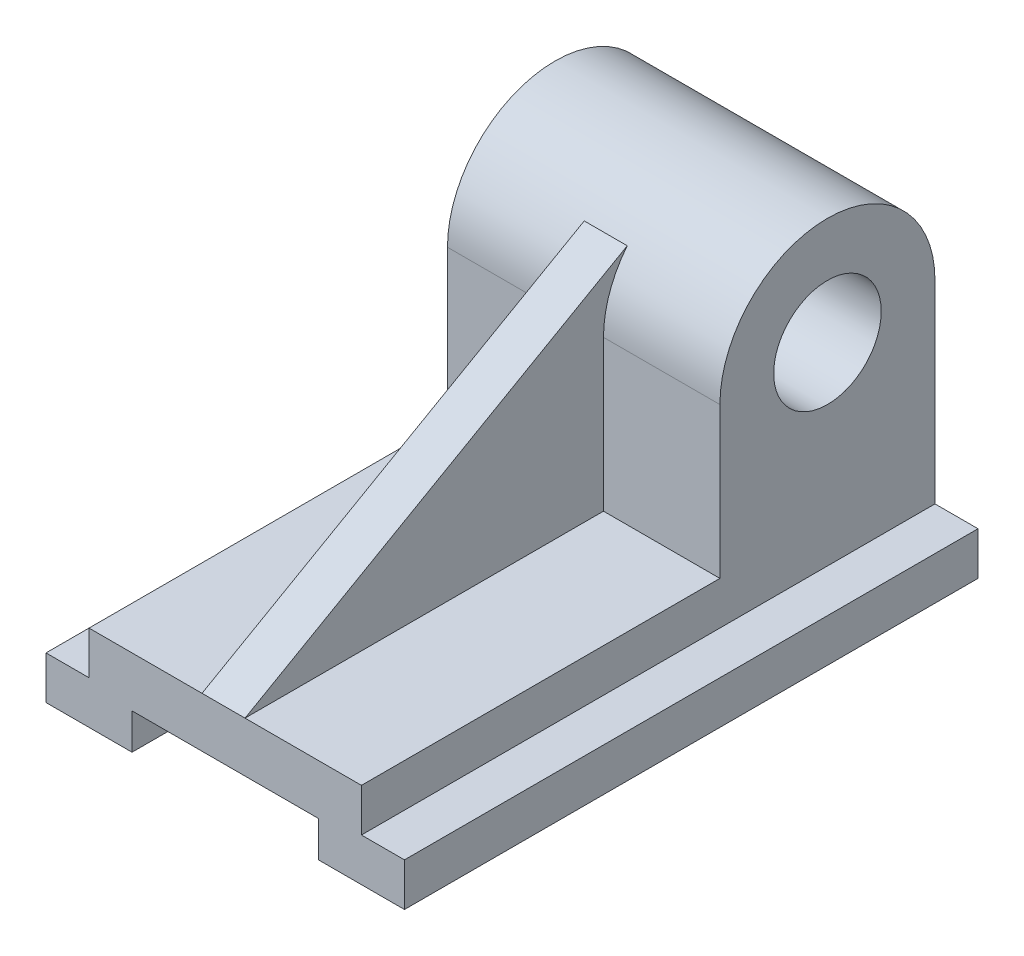
ISO-10303-21;
HEADER;
FILE_DESCRIPTION(('STEP AP214'),'2;1');
FILE_NAME('part.step','',(''),(''),'','','');
FILE_SCHEMA(('AUTOMOTIVE_DESIGN { 1 0 10303 214 1 1 1 1 }'));
ENDSEC;
DATA;
#1=APPLICATION_CONTEXT('core data for automotive mechanical design processes');
#2=APPLICATION_PROTOCOL_DEFINITION('international standard','automotive_design',2000,#1);
#3=PRODUCT_CONTEXT('',#1,'mechanical');
#4=PRODUCT('Part','Part','',(#3));
#5=PRODUCT_RELATED_PRODUCT_CATEGORY('part','',(#4));
#6=PRODUCT_DEFINITION_FORMATION('','',#4);
#7=PRODUCT_DEFINITION_CONTEXT('part definition',#1,'design');
#8=PRODUCT_DEFINITION('design','',#6,#7);
#9=PRODUCT_DEFINITION_SHAPE('','',#8);
#10=(LENGTH_UNIT() NAMED_UNIT(*) SI_UNIT(.MILLI.,.METRE.));
#11=(NAMED_UNIT(*) PLANE_ANGLE_UNIT() SI_UNIT($,.RADIAN.));
#12=(NAMED_UNIT(*) SI_UNIT($,.STERADIAN.) SOLID_ANGLE_UNIT());
#13=UNCERTAINTY_MEASURE_WITH_UNIT(LENGTH_MEASURE(1.E-05),#10,'distance_accuracy_value','');
#14=(GEOMETRIC_REPRESENTATION_CONTEXT(3) GLOBAL_UNCERTAINTY_ASSIGNED_CONTEXT((#13)) GLOBAL_UNIT_ASSIGNED_CONTEXT((#10,
#11,#12)) REPRESENTATION_CONTEXT('',''));
#15=CARTESIAN_POINT('',(0.,0.,0.));
#16=DIRECTION('',(0.,0.,1.));
#17=DIRECTION('',(1.,0.,0.));
#18=AXIS2_PLACEMENT_3D('',#15,#16,#17);
#19=CARTESIAN_POINT('',(0.,24.,-160.));
#20=DIRECTION('',(0.,-1.,0.));
#21=DIRECTION('',(0.,0.,-1.));
#22=AXIS2_PLACEMENT_3D('',#19,#20,#21);
#23=PLANE('',#22);
#24=DIRECTION('',(0.,0.,-1.));
#25=VECTOR('',#24,1.);
#26=CARTESIAN_POINT('',(0.,24.,-109.656121138035));
#27=LINE('',#26,#25);
#28=CARTESIAN_POINT('',(0.,24.,0.));
#29=VERTEX_POINT('',#28);
#30=CARTESIAN_POINT('',(0.,24.,-100.));
#31=VERTEX_POINT('',#30);
#32=EDGE_CURVE('E350',#29,#31,#27,.T.);
#33=ORIENTED_EDGE('',*,*,#32,.T.);
#34=DIRECTION('',(1.,0.,0.));
#35=VECTOR('',#34,1.);
#36=CARTESIAN_POINT('',(-31.5215946843854,24.,-100.));
#37=LINE('',#36,#35);
#38=CARTESIAN_POINT('',(-31.5215946843854,24.,-100.));
#39=VERTEX_POINT('',#38);
#40=EDGE_CURVE('E62',#39,#31,#37,.T.);
#41=ORIENTED_EDGE('',*,*,#40,.F.);
#42=DIRECTION('',(0.,0.,1.));
#43=VECTOR('',#42,1.);
#44=CARTESIAN_POINT('',(-31.5215946843854,24.,-160.));
#45=LINE('',#44,#43);
#46=CARTESIAN_POINT('',(-31.5215946843854,24.,0.));
#47=VERTEX_POINT('',#46);
#48=EDGE_CURVE('E227',#39,#47,#45,.T.);
#49=ORIENTED_EDGE('',*,*,#48,.T.);
#50=DIRECTION('',(1.,0.,0.));
#51=VECTOR('',#50,1.);
#52=CARTESIAN_POINT('',(0.,24.,0.));
#53=LINE('',#52,#51);
#54=EDGE_CURVE('E195',#47,#29,#53,.T.);
#55=ORIENTED_EDGE('',*,*,#54,.T.);
#56=EDGE_LOOP('',(#33,#41,#49,#55));
#57=FACE_BOUND('',#56,.T.);
#58=ADVANCED_FACE('F39',(#57),#23,.F.);
#59=CARTESIAN_POINT('',(-31.5215946843854,0.,-100.));
#60=DIRECTION('',(0.,0.,1.));
#61=DIRECTION('',(1.,0.,0.));
#62=AXIS2_PLACEMENT_3D('',#59,#60,#61);
#63=PLANE('',#62);
#64=ORIENTED_EDGE('',*,*,#40,.T.);
#65=DIRECTION('',(0.,1.,0.));
#66=VECTOR('',#65,1.);
#67=CARTESIAN_POINT('',(0.,0.,-100.));
#68=LINE('',#67,#66);
#69=CARTESIAN_POINT('',(0.,66.,-100.));
#70=VERTEX_POINT('',#69);
#71=EDGE_CURVE('E180',#31,#70,#68,.T.);
#72=ORIENTED_EDGE('',*,*,#71,.T.);
#73=DIRECTION('',(1.,0.,0.));
#74=VECTOR('',#73,1.);
#75=CARTESIAN_POINT('',(-31.5215946843854,66.,-100.));
#76=LINE('',#75,#74);
#77=CARTESIAN_POINT('',(-31.5215946843854,66.,-100.));
#78=VERTEX_POINT('',#77);
#79=EDGE_CURVE('E251',#78,#70,#76,.T.);
#80=ORIENTED_EDGE('',*,*,#79,.F.);
#81=DIRECTION('',(0.,-1.,0.));
#82=VECTOR('',#81,1.);
#83=CARTESIAN_POINT('',(-31.5215946843854,0.,-100.));
#84=LINE('',#83,#82);
#85=EDGE_CURVE('E270',#78,#39,#84,.T.);
#86=ORIENTED_EDGE('',*,*,#85,.T.);
#87=EDGE_LOOP('',(#64,#72,#80,#86));
#88=FACE_BOUND('',#87,.T.);
#89=ADVANCED_FACE('F255',(#88),#63,.T.);
#90=CARTESIAN_POINT('',(12.,24.,-100.));
#91=VERTEX_POINT('',#90);
#92=CARTESIAN_POINT('',(44.4784053156146,24.,-100.));
#93=VERTEX_POINT('',#92);
#94=EDGE_CURVE('E188',#91,#93,#37,.T.);
#95=ORIENTED_EDGE('',*,*,#94,.F.);
#96=DIRECTION('',(0.,0.,-1.));
#97=VECTOR('',#96,1.);
#98=CARTESIAN_POINT('',(12.,24.,-109.656121138035));
#99=LINE('',#98,#97);
#100=CARTESIAN_POINT('',(12.,24.,0.));
#101=VERTEX_POINT('',#100);
#102=EDGE_CURVE('E167',#101,#91,#99,.T.);
#103=ORIENTED_EDGE('',*,*,#102,.F.);
#104=CARTESIAN_POINT('',(44.4784053156146,24.,0.));
#105=VERTEX_POINT('',#104);
#106=EDGE_CURVE('E186',#101,#105,#53,.T.);
#107=ORIENTED_EDGE('',*,*,#106,.T.);
#108=DIRECTION('',(0.,0.,1.));
#109=VECTOR('',#108,1.);
#110=CARTESIAN_POINT('',(44.4784053156146,24.,-160.));
#111=LINE('',#110,#109);
#112=EDGE_CURVE('E229',#93,#105,#111,.T.);
#113=ORIENTED_EDGE('',*,*,#112,.F.);
#114=EDGE_LOOP('',(#95,#103,#107,#113));
#115=FACE_BOUND('',#114,.T.);
#116=ADVANCED_FACE('F184',(#115),#23,.F.);
#117=CARTESIAN_POINT('',(0.,10.,-160.));
#118=DIRECTION('',(0.,-1.,0.));
#119=DIRECTION('',(0.,0.,-1.));
#120=AXIS2_PLACEMENT_3D('',#117,#118,#119);
#121=PLANE('',#120);
#122=DIRECTION('',(1.,0.,0.));
#123=VECTOR('',#122,1.);
#124=CARTESIAN_POINT('',(0.,10.,0.));
#125=LINE('',#124,#123);
#126=CARTESIAN_POINT('',(-19.5215946843854,10.,0.));
#127=VERTEX_POINT('',#126);
#128=CARTESIAN_POINT('',(32.4784053156146,10.,0.));
#129=VERTEX_POINT('',#128);
#130=EDGE_CURVE('E281',#127,#129,#125,.T.);
#131=ORIENTED_EDGE('',*,*,#130,.F.);
#132=DIRECTION('',(0.,0.,1.));
#133=VECTOR('',#132,1.);
#134=CARTESIAN_POINT('',(-19.5215946843854,10.,-160.));
#135=LINE('',#134,#133);
#136=CARTESIAN_POINT('',(-19.5215946843854,10.,-160.));
#137=VERTEX_POINT('',#136);
#138=EDGE_CURVE('E213',#137,#127,#135,.T.);
#139=ORIENTED_EDGE('',*,*,#138,.F.);
#140=DIRECTION('',(1.,0.,0.));
#141=VECTOR('',#140,1.);
#142=CARTESIAN_POINT('',(0.,10.,-160.));
#143=LINE('',#142,#141);
#144=CARTESIAN_POINT('',(32.4784053156146,10.,-160.));
#145=VERTEX_POINT('',#144);
#146=EDGE_CURVE('E212',#137,#145,#143,.T.);
#147=ORIENTED_EDGE('',*,*,#146,.T.);
#148=DIRECTION('',(0.,0.,1.));
#149=VECTOR('',#148,1.);
#150=CARTESIAN_POINT('',(32.4784053156146,10.,-160.));
#151=LINE('',#150,#149);
#152=EDGE_CURVE('E242',#145,#129,#151,.T.);
#153=ORIENTED_EDGE('',*,*,#152,.T.);
#154=EDGE_LOOP('',(#131,#139,#147,#153));
#155=FACE_BOUND('',#154,.T.);
#156=ADVANCED_FACE('F41',(#155),#121,.T.);
#157=CARTESIAN_POINT('',(-19.5215946843854,0.,-160.));
#158=DIRECTION('',(1.,0.,0.));
#159=DIRECTION('',(0.,0.,-1.));
#160=AXIS2_PLACEMENT_3D('',#157,#158,#159);
#161=PLANE('',#160);
#162=DIRECTION('',(0.,1.,0.));
#163=VECTOR('',#162,1.);
#164=CARTESIAN_POINT('',(-19.5215946843854,0.,0.));
#165=LINE('',#164,#163);
#166=CARTESIAN_POINT('',(-19.5215946843854,0.,0.));
#167=VERTEX_POINT('',#166);
#168=EDGE_CURVE('E209',#167,#127,#165,.T.);
#169=ORIENTED_EDGE('',*,*,#168,.F.);
#170=DIRECTION('',(0.,0.,1.));
#171=VECTOR('',#170,1.);
#172=CARTESIAN_POINT('',(-19.5215946843854,0.,-160.));
#173=LINE('',#172,#171);
#174=CARTESIAN_POINT('',(-19.5215946843854,0.,-160.));
#175=VERTEX_POINT('',#174);
#176=EDGE_CURVE('E216',#175,#167,#173,.T.);
#177=ORIENTED_EDGE('',*,*,#176,.F.);
#178=DIRECTION('',(0.,1.,0.));
#179=VECTOR('',#178,1.);
#180=CARTESIAN_POINT('',(-19.5215946843854,0.,-160.));
#181=LINE('',#180,#179);
#182=EDGE_CURVE('E244',#175,#137,#181,.T.);
#183=ORIENTED_EDGE('',*,*,#182,.T.);
#184=ORIENTED_EDGE('',*,*,#138,.T.);
#185=EDGE_LOOP('',(#169,#177,#183,#184));
#186=FACE_BOUND('',#185,.T.);
#187=ADVANCED_FACE('F369',(#186),#161,.T.);
#188=CARTESIAN_POINT('',(0.,0.,-160.));
#189=DIRECTION('',(0.,1.,0.));
#190=DIRECTION('',(-1.,0.,0.));
#191=AXIS2_PLACEMENT_3D('',#188,#189,#190);
#192=PLANE('',#191);
#193=DIRECTION('',(-1.,0.,0.));
#194=VECTOR('',#193,1.);
#195=CARTESIAN_POINT('',(0.,0.,0.));
#196=LINE('',#195,#194);
#197=CARTESIAN_POINT('',(-43.5215946843854,0.,0.));
#198=VERTEX_POINT('',#197);
#199=EDGE_CURVE('E208',#167,#198,#196,.T.);
#200=ORIENTED_EDGE('',*,*,#199,.T.);
#201=DIRECTION('',(0.,0.,1.));
#202=VECTOR('',#201,1.);
#203=CARTESIAN_POINT('',(-43.5215946843854,0.,-160.));
#204=LINE('',#203,#202);
#205=CARTESIAN_POINT('',(-43.5215946843854,0.,-160.));
#206=VERTEX_POINT('',#205);
#207=EDGE_CURVE('E218',#206,#198,#204,.T.);
#208=ORIENTED_EDGE('',*,*,#207,.F.);
#209=DIRECTION('',(-1.,0.,0.));
#210=VECTOR('',#209,1.);
#211=CARTESIAN_POINT('',(0.,0.,-160.));
#212=LINE('',#211,#210);
#213=EDGE_CURVE('E294',#175,#206,#212,.T.);
#214=ORIENTED_EDGE('',*,*,#213,.F.);
#215=ORIENTED_EDGE('',*,*,#176,.T.);
#216=EDGE_LOOP('',(#200,#208,#214,#215));
#217=FACE_BOUND('',#216,.T.);
#218=ADVANCED_FACE('F365',(#217),#192,.F.);
#219=CARTESIAN_POINT('',(-43.5215946843854,0.,-160.));
#220=DIRECTION('',(1.,0.,0.));
#221=DIRECTION('',(0.,0.,-1.));
#222=AXIS2_PLACEMENT_3D('',#219,#220,#221);
#223=PLANE('',#222);
#224=DIRECTION('',(0.,1.,0.));
#225=VECTOR('',#224,1.);
#226=CARTESIAN_POINT('',(-43.5215946843854,0.,0.));
#227=LINE('',#226,#225);
#228=CARTESIAN_POINT('',(-43.5215946843854,12.,0.));
#229=VERTEX_POINT('',#228);
#230=EDGE_CURVE('E206',#198,#229,#227,.T.);
#231=ORIENTED_EDGE('',*,*,#230,.T.);
#232=DIRECTION('',(0.,0.,1.));
#233=VECTOR('',#232,1.);
#234=CARTESIAN_POINT('',(-43.5215946843854,12.,-160.));
#235=LINE('',#234,#233);
#236=CARTESIAN_POINT('',(-43.5215946843854,12.,-160.));
#237=VERTEX_POINT('',#236);
#238=EDGE_CURVE('E221',#237,#229,#235,.T.);
#239=ORIENTED_EDGE('',*,*,#238,.F.);
#240=DIRECTION('',(0.,1.,0.));
#241=VECTOR('',#240,1.);
#242=CARTESIAN_POINT('',(-43.5215946843854,0.,-160.));
#243=LINE('',#242,#241);
#244=EDGE_CURVE('E304',#206,#237,#243,.T.);
#245=ORIENTED_EDGE('',*,*,#244,.F.);
#246=ORIENTED_EDGE('',*,*,#207,.T.);
#247=EDGE_LOOP('',(#231,#239,#245,#246));
#248=FACE_BOUND('',#247,.T.);
#249=ADVANCED_FACE('F361',(#248),#223,.F.);
#250=CARTESIAN_POINT('',(0.,12.,-160.));
#251=DIRECTION('',(0.,-1.,0.));
#252=DIRECTION('',(0.,0.,-1.));
#253=AXIS2_PLACEMENT_3D('',#250,#251,#252);
#254=PLANE('',#253);
#255=DIRECTION('',(1.,0.,0.));
#256=VECTOR('',#255,1.);
#257=CARTESIAN_POINT('',(0.,12.,0.));
#258=LINE('',#257,#256);
#259=CARTESIAN_POINT('',(-31.5215946843854,12.,0.));
#260=VERTEX_POINT('',#259);
#261=EDGE_CURVE('E204',#229,#260,#258,.T.);
#262=ORIENTED_EDGE('',*,*,#261,.T.);
#263=DIRECTION('',(0.,0.,1.));
#264=VECTOR('',#263,1.);
#265=CARTESIAN_POINT('',(-31.5215946843854,12.,-160.));
#266=LINE('',#265,#264);
#267=CARTESIAN_POINT('',(-31.5215946843854,12.,-160.));
#268=VERTEX_POINT('',#267);
#269=EDGE_CURVE('E224',#268,#260,#266,.T.);
#270=ORIENTED_EDGE('',*,*,#269,.F.);
#271=DIRECTION('',(1.,0.,0.));
#272=VECTOR('',#271,1.);
#273=CARTESIAN_POINT('',(0.,12.,-160.));
#274=LINE('',#273,#272);
#275=EDGE_CURVE('E302',#237,#268,#274,.T.);
#276=ORIENTED_EDGE('',*,*,#275,.F.);
#277=ORIENTED_EDGE('',*,*,#238,.T.);
#278=EDGE_LOOP('',(#262,#270,#276,#277));
#279=FACE_BOUND('',#278,.T.);
#280=ADVANCED_FACE('F356',(#279),#254,.F.);
#281=CARTESIAN_POINT('',(-31.5215946843854,0.,-160.));
#282=DIRECTION('',(1.,0.,0.));
#283=DIRECTION('',(0.,0.,-1.));
#284=AXIS2_PLACEMENT_3D('',#281,#282,#283);
#285=PLANE('',#284);
#286=DIRECTION('',(0.,1.,0.));
#287=VECTOR('',#286,1.);
#288=CARTESIAN_POINT('',(-31.5215946843854,0.,0.));
#289=LINE('',#288,#287);
#290=EDGE_CURVE('E197',#260,#47,#289,.T.);
#291=ORIENTED_EDGE('',*,*,#290,.T.);
#292=ORIENTED_EDGE('',*,*,#48,.F.);
#293=ORIENTED_EDGE('',*,*,#85,.F.);
#294=CARTESIAN_POINT('',(-31.5215946843854,66.,-130.));
#295=DIRECTION('',(1.,0.,0.));
#296=DIRECTION('',(0.,0.,-1.));
#297=AXIS2_PLACEMENT_3D('',#294,#295,#296);
#298=CIRCLE('',#297,30.);
#299=CARTESIAN_POINT('',(-31.5215946843854,66.,-160.));
#300=VERTEX_POINT('',#299);
#301=EDGE_CURVE('E267',#300,#78,#298,.T.);
#302=ORIENTED_EDGE('',*,*,#301,.F.);
#303=DIRECTION('',(0.,1.,0.));
#304=VECTOR('',#303,1.);
#305=CARTESIAN_POINT('',(-31.5215946843854,0.,-160.));
#306=LINE('',#305,#304);
#307=EDGE_CURVE('E300',#268,#300,#306,.T.);
#308=ORIENTED_EDGE('',*,*,#307,.F.);
#309=ORIENTED_EDGE('',*,*,#269,.T.);
#310=EDGE_LOOP('',(#291,#292,#293,#302,#308,#309));
#311=FACE_BOUND('',#310,.T.);
#312=CARTESIAN_POINT('',(-31.5215946843854,66.,-130.));
#313=DIRECTION('',(1.,0.,0.));
#314=DIRECTION('',(0.,0.,-1.));
#315=AXIS2_PLACEMENT_3D('',#312,#313,#314);
#316=CIRCLE('',#315,15.);
#317=CARTESIAN_POINT('',(-31.5215946843854,66.,-145.));
#318=VERTEX_POINT('',#317);
#319=EDGE_CURVE('E264',#318,#318,#316,.T.);
#320=ORIENTED_EDGE('',*,*,#319,.T.);
#321=EDGE_LOOP('',(#320));
#322=FACE_BOUND('',#321,.T.);
#323=ADVANCED_FACE('F347',(#311,#322),#285,.F.);
#324=CARTESIAN_POINT('',(44.4784053156146,0.,-160.));
#325=DIRECTION('',(-1.,0.,0.));
#326=DIRECTION('',(0.,0.,1.));
#327=AXIS2_PLACEMENT_3D('',#324,#325,#326);
#328=PLANE('',#327);
#329=DIRECTION('',(0.,-1.,0.));
#330=VECTOR('',#329,1.);
#331=CARTESIAN_POINT('',(44.4784053156146,0.,0.));
#332=LINE('',#331,#330);
#333=CARTESIAN_POINT('',(44.4784053156146,12.,0.));
#334=VERTEX_POINT('',#333);
#335=EDGE_CURVE('E194',#105,#334,#332,.T.);
#336=ORIENTED_EDGE('',*,*,#335,.T.);
#337=DIRECTION('',(0.,0.,1.));
#338=VECTOR('',#337,1.);
#339=CARTESIAN_POINT('',(44.4784053156146,12.,-160.));
#340=LINE('',#339,#338);
#341=CARTESIAN_POINT('',(44.4784053156146,12.,-160.));
#342=VERTEX_POINT('',#341);
#343=EDGE_CURVE('E231',#342,#334,#340,.T.);
#344=ORIENTED_EDGE('',*,*,#343,.F.);
#345=DIRECTION('',(0.,-1.,0.));
#346=VECTOR('',#345,1.);
#347=CARTESIAN_POINT('',(44.4784053156146,0.,-160.));
#348=LINE('',#347,#346);
#349=CARTESIAN_POINT('',(44.4784053156146,66.,-160.));
#350=VERTEX_POINT('',#349);
#351=EDGE_CURVE('E298',#350,#342,#348,.T.);
#352=ORIENTED_EDGE('',*,*,#351,.F.);
#353=CARTESIAN_POINT('',(44.4784053156146,66.,-130.));
#354=DIRECTION('',(1.,0.,0.));
#355=DIRECTION('',(0.,0.,-1.));
#356=AXIS2_PLACEMENT_3D('',#353,#354,#355);
#357=CIRCLE('',#356,30.);
#358=CARTESIAN_POINT('',(44.4784053156146,66.,-100.));
#359=VERTEX_POINT('',#358);
#360=EDGE_CURVE('E275',#350,#359,#357,.T.);
#361=ORIENTED_EDGE('',*,*,#360,.T.);
#362=DIRECTION('',(0.,-1.,0.));
#363=VECTOR('',#362,1.);
#364=CARTESIAN_POINT('',(44.4784053156146,0.,-100.));
#365=LINE('',#364,#363);
#366=EDGE_CURVE('E268',#359,#93,#365,.T.);
#367=ORIENTED_EDGE('',*,*,#366,.T.);
#368=ORIENTED_EDGE('',*,*,#112,.T.);
#369=EDGE_LOOP('',(#336,#344,#352,#361,#367,#368));
#370=FACE_BOUND('',#369,.T.);
#371=CARTESIAN_POINT('',(44.4784053156146,66.,-130.));
#372=DIRECTION('',(1.,0.,0.));
#373=DIRECTION('',(0.,0.,-1.));
#374=AXIS2_PLACEMENT_3D('',#371,#372,#373);
#375=CIRCLE('',#374,15.);
#376=CARTESIAN_POINT('',(44.4784053156146,66.,-145.));
#377=VERTEX_POINT('',#376);
#378=EDGE_CURVE('E260',#377,#377,#375,.T.);
#379=ORIENTED_EDGE('',*,*,#378,.F.);
#380=EDGE_LOOP('',(#379));
#381=FACE_BOUND('',#380,.T.);
#382=ADVANCED_FACE('F339',(#370,#381),#328,.F.);
#383=CARTESIAN_POINT('',(0.,12.,-160.));
#384=DIRECTION('',(0.,-1.,0.));
#385=DIRECTION('',(0.,0.,-1.));
#386=AXIS2_PLACEMENT_3D('',#383,#384,#385);
#387=PLANE('',#386);
#388=DIRECTION('',(1.,0.,0.));
#389=VECTOR('',#388,1.);
#390=CARTESIAN_POINT('',(0.,12.,0.));
#391=LINE('',#390,#389);
#392=CARTESIAN_POINT('',(56.4784053156146,12.,0.));
#393=VERTEX_POINT('',#392);
#394=EDGE_CURVE('E198',#334,#393,#391,.T.);
#395=ORIENTED_EDGE('',*,*,#394,.T.);
#396=DIRECTION('',(0.,0.,1.));
#397=VECTOR('',#396,1.);
#398=CARTESIAN_POINT('',(56.4784053156146,12.,-160.));
#399=LINE('',#398,#397);
#400=CARTESIAN_POINT('',(56.4784053156146,12.,-160.));
#401=VERTEX_POINT('',#400);
#402=EDGE_CURVE('E234',#401,#393,#399,.T.);
#403=ORIENTED_EDGE('',*,*,#402,.F.);
#404=DIRECTION('',(1.,0.,0.));
#405=VECTOR('',#404,1.);
#406=CARTESIAN_POINT('',(0.,12.,-160.));
#407=LINE('',#406,#405);
#408=EDGE_CURVE('E296',#342,#401,#407,.T.);
#409=ORIENTED_EDGE('',*,*,#408,.F.);
#410=ORIENTED_EDGE('',*,*,#343,.T.);
#411=EDGE_LOOP('',(#395,#403,#409,#410));
#412=FACE_BOUND('',#411,.T.);
#413=ADVANCED_FACE('F318',(#412),#387,.F.);
#414=CARTESIAN_POINT('',(56.4784053156146,0.,-160.));
#415=DIRECTION('',(-1.,0.,0.));
#416=DIRECTION('',(0.,-1.,0.));
#417=AXIS2_PLACEMENT_3D('',#414,#415,#416);
#418=PLANE('',#417);
#419=DIRECTION('',(0.,-1.,0.));
#420=VECTOR('',#419,1.);
#421=CARTESIAN_POINT('',(56.4784053156146,0.,0.));
#422=LINE('',#421,#420);
#423=CARTESIAN_POINT('',(56.4784053156146,0.,0.));
#424=VERTEX_POINT('',#423);
#425=EDGE_CURVE('E315',#393,#424,#422,.T.);
#426=ORIENTED_EDGE('',*,*,#425,.T.);
#427=DIRECTION('',(0.,0.,1.));
#428=VECTOR('',#427,1.);
#429=CARTESIAN_POINT('',(56.4784053156146,0.,-160.));
#430=LINE('',#429,#428);
#431=CARTESIAN_POINT('',(56.4784053156146,0.,-160.));
#432=VERTEX_POINT('',#431);
#433=EDGE_CURVE('E237',#432,#424,#430,.T.);
#434=ORIENTED_EDGE('',*,*,#433,.F.);
#435=DIRECTION('',(0.,-1.,0.));
#436=VECTOR('',#435,1.);
#437=CARTESIAN_POINT('',(56.4784053156146,0.,-160.));
#438=LINE('',#437,#436);
#439=EDGE_CURVE('E293',#401,#432,#438,.T.);
#440=ORIENTED_EDGE('',*,*,#439,.F.);
#441=ORIENTED_EDGE('',*,*,#402,.T.);
#442=EDGE_LOOP('',(#426,#434,#440,#441));
#443=FACE_BOUND('',#442,.T.);
#444=ADVANCED_FACE('F324',(#443),#418,.F.);
#445=CARTESIAN_POINT('',(32.4784053156146,0.,0.));
#446=VERTEX_POINT('',#445);
#447=EDGE_CURVE('E312',#424,#446,#196,.T.);
#448=ORIENTED_EDGE('',*,*,#447,.T.);
#449=DIRECTION('',(0.,0.,1.));
#450=VECTOR('',#449,1.);
#451=CARTESIAN_POINT('',(32.4784053156146,0.,-160.));
#452=LINE('',#451,#450);
#453=CARTESIAN_POINT('',(32.4784053156146,0.,-160.));
#454=VERTEX_POINT('',#453);
#455=EDGE_CURVE('E240',#454,#446,#452,.T.);
#456=ORIENTED_EDGE('',*,*,#455,.F.);
#457=EDGE_CURVE('E291',#432,#454,#212,.T.);
#458=ORIENTED_EDGE('',*,*,#457,.F.);
#459=ORIENTED_EDGE('',*,*,#433,.T.);
#460=EDGE_LOOP('',(#448,#456,#458,#459));
#461=FACE_BOUND('',#460,.T.);
#462=ADVANCED_FACE('F330',(#461),#192,.F.);
#463=CARTESIAN_POINT('',(32.4784053156146,0.,-160.));
#464=DIRECTION('',(-1.,0.,0.));
#465=DIRECTION('',(0.,0.,1.));
#466=AXIS2_PLACEMENT_3D('',#463,#464,#465);
#467=PLANE('',#466);
#468=DIRECTION('',(0.,-1.,0.));
#469=VECTOR('',#468,1.);
#470=CARTESIAN_POINT('',(32.4784053156146,0.,0.));
#471=LINE('',#470,#469);
#472=EDGE_CURVE('E309',#129,#446,#471,.T.);
#473=ORIENTED_EDGE('',*,*,#472,.F.);
#474=ORIENTED_EDGE('',*,*,#152,.F.);
#475=DIRECTION('',(0.,-1.,0.));
#476=VECTOR('',#475,1.);
#477=CARTESIAN_POINT('',(32.4784053156146,0.,-160.));
#478=LINE('',#477,#476);
#479=EDGE_CURVE('E288',#145,#454,#478,.T.);
#480=ORIENTED_EDGE('',*,*,#479,.T.);
#481=ORIENTED_EDGE('',*,*,#455,.T.);
#482=EDGE_LOOP('',(#473,#474,#480,#481));
#483=FACE_BOUND('',#482,.T.);
#484=ADVANCED_FACE('F373',(#483),#467,.T.);
#485=CARTESIAN_POINT('',(0.,0.,-160.));
#486=DIRECTION('',(0.,0.,1.));
#487=DIRECTION('',(1.,0.,0.));
#488=AXIS2_PLACEMENT_3D('',#485,#486,#487);
#489=PLANE('',#488);
#490=ORIENTED_EDGE('',*,*,#146,.F.);
#491=ORIENTED_EDGE('',*,*,#182,.F.);
#492=ORIENTED_EDGE('',*,*,#213,.T.);
#493=ORIENTED_EDGE('',*,*,#244,.T.);
#494=ORIENTED_EDGE('',*,*,#275,.T.);
#495=ORIENTED_EDGE('',*,*,#307,.T.);
#496=DIRECTION('',(1.,0.,0.));
#497=VECTOR('',#496,1.);
#498=CARTESIAN_POINT('',(-31.5215946843854,66.,-160.));
#499=LINE('',#498,#497);
#500=EDGE_CURVE('E272',#300,#350,#499,.T.);
#501=ORIENTED_EDGE('',*,*,#500,.T.);
#502=ORIENTED_EDGE('',*,*,#351,.T.);
#503=ORIENTED_EDGE('',*,*,#408,.T.);
#504=ORIENTED_EDGE('',*,*,#439,.T.);
#505=ORIENTED_EDGE('',*,*,#457,.T.);
#506=ORIENTED_EDGE('',*,*,#479,.F.);
#507=EDGE_LOOP('',(#490,#491,#492,#493,#494,#495,#501,#502,#503,#504,#505,#506));
#508=FACE_BOUND('',#507,.T.);
#509=ADVANCED_FACE('F335',(#508),#489,.F.);
#510=CARTESIAN_POINT('',(0.,0.,0.));
#511=DIRECTION('',(0.,0.,1.));
#512=DIRECTION('',(1.,0.,0.));
#513=AXIS2_PLACEMENT_3D('',#510,#511,#512);
#514=PLANE('',#513);
#515=ORIENTED_EDGE('',*,*,#130,.T.);
#516=ORIENTED_EDGE('',*,*,#472,.T.);
#517=ORIENTED_EDGE('',*,*,#447,.F.);
#518=ORIENTED_EDGE('',*,*,#425,.F.);
#519=ORIENTED_EDGE('',*,*,#394,.F.);
#520=ORIENTED_EDGE('',*,*,#335,.F.);
#521=ORIENTED_EDGE('',*,*,#106,.F.);
#522=DIRECTION('',(-1.,0.,0.));
#523=VECTOR('',#522,1.);
#524=CARTESIAN_POINT('',(12.,24.,0.));
#525=LINE('',#524,#523);
#526=EDGE_CURVE('E172',#101,#29,#525,.T.);
#527=ORIENTED_EDGE('',*,*,#526,.T.);
#528=ORIENTED_EDGE('',*,*,#54,.F.);
#529=ORIENTED_EDGE('',*,*,#290,.F.);
#530=ORIENTED_EDGE('',*,*,#261,.F.);
#531=ORIENTED_EDGE('',*,*,#230,.F.);
#532=ORIENTED_EDGE('',*,*,#199,.F.);
#533=ORIENTED_EDGE('',*,*,#168,.T.);
#534=EDGE_LOOP('',(#515,#516,#517,#518,#519,#520,#521,#527,#528,#529,#530,#531,#532,#533));
#535=FACE_BOUND('',#534,.T.);
#536=ADVANCED_FACE('F192',(#535),#514,.T.);
#537=DIRECTION('',(0.,1.,0.));
#538=VECTOR('',#537,1.);
#539=CARTESIAN_POINT('',(12.,0.,-100.));
#540=LINE('',#539,#538);
#541=CARTESIAN_POINT('',(12.,66.,-100.));
#542=VERTEX_POINT('',#541);
#543=EDGE_CURVE('E258',#91,#542,#540,.T.);
#544=ORIENTED_EDGE('',*,*,#543,.F.);
#545=ORIENTED_EDGE('',*,*,#94,.T.);
#546=ORIENTED_EDGE('',*,*,#366,.F.);
#547=EDGE_CURVE('E283',#542,#359,#76,.T.);
#548=ORIENTED_EDGE('',*,*,#547,.F.);
#549=EDGE_LOOP('',(#544,#545,#546,#548));
#550=FACE_BOUND('',#549,.T.);
#551=ADVANCED_FACE('F343',(#550),#63,.T.);
#552=CARTESIAN_POINT('',(-31.5215946843854,66.,-130.));
#553=DIRECTION('',(1.,0.,0.));
#554=DIRECTION('',(0.,0.,-1.));
#555=AXIS2_PLACEMENT_3D('',#552,#553,#554);
#556=CYLINDRICAL_SURFACE('',#555,15.);
#557=ORIENTED_EDGE('',*,*,#319,.F.);
#558=EDGE_LOOP('',(#557));
#559=FACE_BOUND('',#558,.T.);
#560=ORIENTED_EDGE('',*,*,#378,.T.);
#561=EDGE_LOOP('',(#560));
#562=FACE_BOUND('',#561,.T.);
#563=ADVANCED_FACE('F454',(#559,#562),#556,.F.);
#564=CARTESIAN_POINT('',(-31.5215946843854,66.,-130.));
#565=DIRECTION('',(1.,0.,0.));
#566=DIRECTION('',(0.,0.,-1.));
#567=AXIS2_PLACEMENT_3D('',#564,#565,#566);
#568=CYLINDRICAL_SURFACE('',#567,30.);
#569=CARTESIAN_POINT('',(12.,66.,-130.));
#570=DIRECTION('',(1.,0.,0.));
#571=DIRECTION('',(0.,0.,-1.));
#572=AXIS2_PLACEMENT_3D('',#569,#570,#571);
#573=CIRCLE('',#572,30.);
#574=CARTESIAN_POINT('',(12.,84.8093004394661,-106.62885931372));
#575=VERTEX_POINT('',#574);
#576=EDGE_CURVE('E11',#542,#575,#573,.F.);
#577=ORIENTED_EDGE('',*,*,#576,.F.);
#578=ORIENTED_EDGE('',*,*,#547,.T.);
#579=ORIENTED_EDGE('',*,*,#360,.F.);
#580=ORIENTED_EDGE('',*,*,#500,.F.);
#581=ORIENTED_EDGE('',*,*,#301,.T.);
#582=ORIENTED_EDGE('',*,*,#79,.T.);
#583=CARTESIAN_POINT('',(0.,66.,-130.));
#584=DIRECTION('',(1.,0.,0.));
#585=DIRECTION('',(0.,0.,-1.));
#586=AXIS2_PLACEMENT_3D('',#583,#584,#585);
#587=CIRCLE('',#586,30.);
#588=CARTESIAN_POINT('',(0.,84.8093004394661,-106.62885931372));
#589=VERTEX_POINT('',#588);
#590=EDGE_CURVE('E215',#70,#589,#587,.F.);
#591=ORIENTED_EDGE('',*,*,#590,.T.);
#592=DIRECTION('',(1.,0.,0.));
#593=VECTOR('',#592,1.);
#594=CARTESIAN_POINT('',(-31.5215946843854,84.8093004394661,-106.62885931372));
#595=LINE('',#594,#593);
#596=EDGE_CURVE('E47',#589,#575,#595,.T.);
#597=ORIENTED_EDGE('',*,*,#596,.T.);
#598=EDGE_LOOP('',(#577,#578,#579,#580,#581,#582,#591,#597));
#599=FACE_BOUND('',#598,.T.);
#600=ADVANCED_FACE('F247',(#599),#568,.T.);
#601=CARTESIAN_POINT('',(12.,24.,0.));
#602=DIRECTION('',(0.,-0.868669122166521,-0.495392729250688));
#603=DIRECTION('',(0.,0.495392729250688,-0.868669122166522));
#604=AXIS2_PLACEMENT_3D('',#601,#602,#603);
#605=PLANE('',#604);
#606=ORIENTED_EDGE('',*,*,#596,.F.);
#607=DIRECTION('',(0.,-0.495392729250688,0.868669122166521));
#608=VECTOR('',#607,1.);
#609=CARTESIAN_POINT('',(0.,24.,0.));
#610=LINE('',#609,#608);
#611=EDGE_CURVE('E54',#589,#29,#610,.T.);
#612=ORIENTED_EDGE('',*,*,#611,.T.);
#613=ORIENTED_EDGE('',*,*,#526,.F.);
#614=DIRECTION('',(0.,-0.495392729250688,0.868669122166521));
#615=VECTOR('',#614,1.);
#616=CARTESIAN_POINT('',(12.,24.,0.));
#617=LINE('',#616,#615);
#618=EDGE_CURVE('E163',#575,#101,#617,.T.);
#619=ORIENTED_EDGE('',*,*,#618,.F.);
#620=EDGE_LOOP('',(#606,#612,#613,#619));
#621=FACE_BOUND('',#620,.T.);
#622=ADVANCED_FACE('F175',(#621),#605,.F.);
#623=CARTESIAN_POINT('',(12.,0.,0.));
#624=DIRECTION('',(1.,0.,0.));
#625=DIRECTION('',(0.,0.,-1.));
#626=AXIS2_PLACEMENT_3D('',#623,#624,#625);
#627=PLANE('',#626);
#628=ORIENTED_EDGE('',*,*,#102,.T.);
#629=ORIENTED_EDGE('',*,*,#543,.T.);
#630=ORIENTED_EDGE('',*,*,#576,.T.);
#631=ORIENTED_EDGE('',*,*,#618,.T.);
#632=EDGE_LOOP('',(#628,#629,#630,#631));
#633=FACE_BOUND('',#632,.T.);
#634=ADVANCED_FACE('F165',(#633),#627,.T.);
#635=CARTESIAN_POINT('',(0.,0.,0.));
#636=DIRECTION('',(1.,0.,0.));
#637=DIRECTION('',(0.,0.,-1.));
#638=AXIS2_PLACEMENT_3D('',#635,#636,#637);
#639=PLANE('',#638);
#640=ORIENTED_EDGE('',*,*,#71,.F.);
#641=ORIENTED_EDGE('',*,*,#32,.F.);
#642=ORIENTED_EDGE('',*,*,#611,.F.);
#643=ORIENTED_EDGE('',*,*,#590,.F.);
#644=EDGE_LOOP('',(#640,#641,#642,#643));
#645=FACE_BOUND('',#644,.T.);
#646=ADVANCED_FACE('F253',(#645),#639,.F.);
#647=CLOSED_SHELL('',(#58,#89,#116,#156,#187,#218,#249,#280,#323,#382,#413,#444,#462,#484,#509,
#536,#551,#563,#600,#622,#634,#646));
#648=MANIFOLD_SOLID_BREP('B2',#647);
#649=ADVANCED_BREP_SHAPE_REPRESENTATION('',(#18,#648),#14);
#650=SHAPE_DEFINITION_REPRESENTATION(#9,#649);
ENDSEC;
END-ISO-10303-21;
